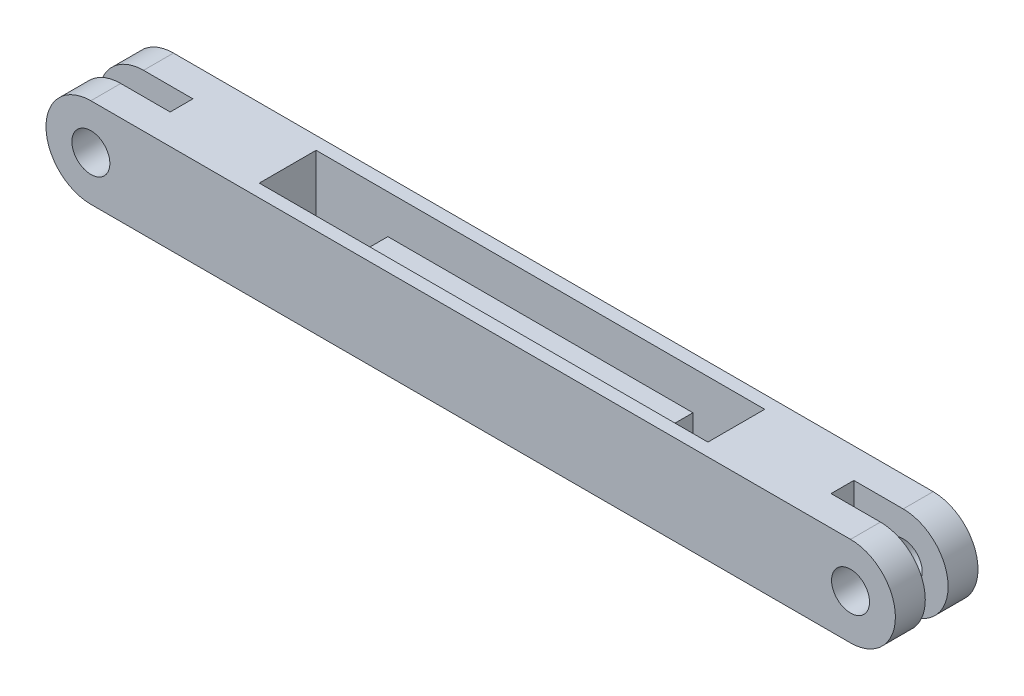
ISO-10303-21;
HEADER;
FILE_DESCRIPTION(('STEP AP214'),'2;1');
FILE_NAME('part.step','',(''),(''),'','','');
FILE_SCHEMA(('AUTOMOTIVE_DESIGN { 1 0 10303 214 1 1 1 1 }'));
ENDSEC;
DATA;
#1=APPLICATION_CONTEXT('core data for automotive mechanical design processes');
#2=APPLICATION_PROTOCOL_DEFINITION('international standard','automotive_design',2000,#1);
#3=PRODUCT_CONTEXT('',#1,'mechanical');
#4=PRODUCT('Part','Part','',(#3));
#5=PRODUCT_RELATED_PRODUCT_CATEGORY('part','',(#4));
#6=PRODUCT_DEFINITION_FORMATION('','',#4);
#7=PRODUCT_DEFINITION_CONTEXT('part definition',#1,'design');
#8=PRODUCT_DEFINITION('design','',#6,#7);
#9=PRODUCT_DEFINITION_SHAPE('','',#8);
#10=(LENGTH_UNIT() NAMED_UNIT(*) SI_UNIT(.MILLI.,.METRE.));
#11=(NAMED_UNIT(*) PLANE_ANGLE_UNIT() SI_UNIT($,.RADIAN.));
#12=(NAMED_UNIT(*) SI_UNIT($,.STERADIAN.) SOLID_ANGLE_UNIT());
#13=UNCERTAINTY_MEASURE_WITH_UNIT(LENGTH_MEASURE(1.E-05),#10,'distance_accuracy_value','');
#14=(GEOMETRIC_REPRESENTATION_CONTEXT(3) GLOBAL_UNCERTAINTY_ASSIGNED_CONTEXT((#13)) GLOBAL_UNIT_ASSIGNED_CONTEXT((#10,
#11,#12)) REPRESENTATION_CONTEXT('',''));
#15=CARTESIAN_POINT('',(0.,0.,0.));
#16=DIRECTION('',(0.,0.,1.));
#17=DIRECTION('',(1.,0.,0.));
#18=AXIS2_PLACEMENT_3D('',#15,#16,#17);
#19=CARTESIAN_POINT('',(0.,1.42391304347826,0.));
#20=DIRECTION('',(0.,-1.,0.));
#21=DIRECTION('',(0.,0.,-1.));
#22=AXIS2_PLACEMENT_3D('',#19,#20,#21);
#23=PLANE('',#22);
#24=DIRECTION('',(0.,0.,-1.));
#25=VECTOR('',#24,1.);
#26=CARTESIAN_POINT('',(-9.2173913043478,1.42391304347826,2.15500000000001));
#27=LINE('',#26,#25);
#28=CARTESIAN_POINT('',(-9.2173913043478,1.42391304347826,11.655));
#29=VERTEX_POINT('',#28);
#30=CARTESIAN_POINT('',(-9.2173913043478,1.42391304347826,2.15500000000001));
#31=VERTEX_POINT('',#30);
#32=EDGE_CURVE('E191',#29,#31,#27,.T.);
#33=ORIENTED_EDGE('',*,*,#32,.F.);
#34=DIRECTION('',(1.,0.,0.));
#35=VECTOR('',#34,1.);
#36=CARTESIAN_POINT('',(-21.2173913043478,1.42391304347826,11.655));
#37=LINE('',#36,#35);
#38=CARTESIAN_POINT('',(41.7826086956522,1.42391304347826,11.655));
#39=VERTEX_POINT('',#38);
#40=EDGE_CURVE('E201',#29,#39,#37,.T.);
#41=ORIENTED_EDGE('',*,*,#40,.T.);
#42=DIRECTION('',(0.,0.,1.));
#43=VECTOR('',#42,1.);
#44=CARTESIAN_POINT('',(41.7826086956522,1.42391304347826,2.15500000000001));
#45=LINE('',#44,#43);
#46=CARTESIAN_POINT('',(41.7826086956522,1.42391304347826,2.15500000000001));
#47=VERTEX_POINT('',#46);
#48=EDGE_CURVE('E200',#47,#39,#45,.T.);
#49=ORIENTED_EDGE('',*,*,#48,.F.);
#50=DIRECTION('',(1.,0.,0.));
#51=VECTOR('',#50,1.);
#52=CARTESIAN_POINT('',(-21.2173913043478,1.42391304347826,2.15500000000001));
#53=LINE('',#52,#51);
#54=EDGE_CURVE('E189',#31,#47,#53,.T.);
#55=ORIENTED_EDGE('',*,*,#54,.F.);
#56=EDGE_LOOP('',(#33,#41,#49,#55));
#57=FACE_BOUND('',#56,.T.);
#58=ADVANCED_FACE('F44',(#57),#23,.F.);
#59=CARTESIAN_POINT('',(-47.2173913043478,7.92391304347826,5.));
#60=DIRECTION('',(0.,-1.,0.));
#61=DIRECTION('',(0.,0.,-1.));
#62=AXIS2_PLACEMENT_3D('',#59,#60,#61);
#63=PLANE('',#62);
#64=DIRECTION('',(-1.,0.,0.));
#65=VECTOR('',#64,1.);
#66=CARTESIAN_POINT('',(-47.2173913043478,7.92391304347826,0.));
#67=LINE('',#66,#65);
#68=CARTESIAN_POINT('',(79.7826086956522,7.92391304347826,0.));
#69=VERTEX_POINT('',#68);
#70=CARTESIAN_POINT('',(-47.2173913043478,7.92391304347826,0.));
#71=VERTEX_POINT('',#70);
#72=EDGE_CURVE('E352',#69,#71,#67,.T.);
#73=ORIENTED_EDGE('',*,*,#72,.T.);
#74=DIRECTION('',(0.,0.,-1.));
#75=VECTOR('',#74,1.);
#76=CARTESIAN_POINT('',(-47.2173913043478,7.92391304347826,5.));
#77=LINE('',#76,#75);
#78=CARTESIAN_POINT('',(-47.2173913043478,7.92391304347826,5.));
#79=VERTEX_POINT('',#78);
#80=EDGE_CURVE('E366',#79,#71,#77,.T.);
#81=ORIENTED_EDGE('',*,*,#80,.F.);
#82=DIRECTION('',(-1.,0.,0.));
#83=VECTOR('',#82,1.);
#84=CARTESIAN_POINT('',(-47.2173913043478,7.92391304347826,5.));
#85=LINE('',#84,#83);
#86=CARTESIAN_POINT('',(-38.9623913043478,7.92391304347826,5.));
#87=VERTEX_POINT('',#86);
#88=EDGE_CURVE('E365',#87,#79,#85,.T.);
#89=ORIENTED_EDGE('',*,*,#88,.F.);
#90=DIRECTION('',(0.,0.,-1.));
#91=VECTOR('',#90,1.);
#92=CARTESIAN_POINT('',(-38.9623913043478,7.92391304347824,8.81));
#93=LINE('',#92,#91);
#94=CARTESIAN_POINT('',(-38.9623913043478,7.92391304347824,8.81));
#95=VERTEX_POINT('',#94);
#96=EDGE_CURVE('E328',#95,#87,#93,.T.);
#97=ORIENTED_EDGE('',*,*,#96,.F.);
#98=DIRECTION('',(-1.,0.,0.));
#99=VECTOR('',#98,1.);
#100=CARTESIAN_POINT('',(-47.2173913043478,7.92391304347826,8.81));
#101=LINE('',#100,#99);
#102=CARTESIAN_POINT('',(-47.2173913043478,7.92391304347826,8.81));
#103=VERTEX_POINT('',#102);
#104=EDGE_CURVE('E282',#95,#103,#101,.T.);
#105=ORIENTED_EDGE('',*,*,#104,.T.);
#106=DIRECTION('',(0.,0.,-1.));
#107=VECTOR('',#106,1.);
#108=CARTESIAN_POINT('',(-47.2173913043478,7.92391304347826,13.81));
#109=LINE('',#108,#107);
#110=CARTESIAN_POINT('',(-47.2173913043478,7.92391304347826,13.81));
#111=VERTEX_POINT('',#110);
#112=EDGE_CURVE('E267',#111,#103,#109,.T.);
#113=ORIENTED_EDGE('',*,*,#112,.F.);
#114=DIRECTION('',(-1.,0.,0.));
#115=VECTOR('',#114,1.);
#116=CARTESIAN_POINT('',(-47.2173913043478,7.92391304347826,13.81));
#117=LINE('',#116,#115);
#118=CARTESIAN_POINT('',(79.7826086956522,7.92391304347826,13.81));
#119=VERTEX_POINT('',#118);
#120=EDGE_CURVE('E270',#119,#111,#117,.T.);
#121=ORIENTED_EDGE('',*,*,#120,.F.);
#122=DIRECTION('',(0.,0.,-1.));
#123=VECTOR('',#122,1.);
#124=CARTESIAN_POINT('',(79.7826086956522,7.92391304347826,13.81));
#125=LINE('',#124,#123);
#126=CARTESIAN_POINT('',(79.7826086956522,7.92391304347826,8.81));
#127=VERTEX_POINT('',#126);
#128=EDGE_CURVE('E289',#119,#127,#125,.T.);
#129=ORIENTED_EDGE('',*,*,#128,.T.);
#130=CARTESIAN_POINT('',(71.5276086956522,7.92391304347826,8.81));
#131=VERTEX_POINT('',#130);
#132=EDGE_CURVE('E261',#127,#131,#101,.T.);
#133=ORIENTED_EDGE('',*,*,#132,.T.);
#134=DIRECTION('',(0.,0.,-1.));
#135=VECTOR('',#134,1.);
#136=CARTESIAN_POINT('',(71.5276086956522,7.92391304347826,8.81));
#137=LINE('',#136,#135);
#138=CARTESIAN_POINT('',(71.5276086956522,7.92391304347826,5.));
#139=VERTEX_POINT('',#138);
#140=EDGE_CURVE('E311',#131,#139,#137,.T.);
#141=ORIENTED_EDGE('',*,*,#140,.T.);
#142=CARTESIAN_POINT('',(79.7826086956522,7.92391304347826,5.));
#143=VERTEX_POINT('',#142);
#144=EDGE_CURVE('E361',#143,#139,#85,.T.);
#145=ORIENTED_EDGE('',*,*,#144,.F.);
#146=DIRECTION('',(0.,0.,-1.));
#147=VECTOR('',#146,1.);
#148=CARTESIAN_POINT('',(79.7826086956522,7.92391304347826,5.));
#149=LINE('',#148,#147);
#150=EDGE_CURVE('E382',#143,#69,#149,.T.);
#151=ORIENTED_EDGE('',*,*,#150,.T.);
#152=EDGE_LOOP('',(#73,#81,#89,#97,#105,#113,#121,#129,#133,#141,#145,#151));
#153=FACE_BOUND('',#152,.T.);
#154=DIRECTION('',(0.,0.,-1.));
#155=VECTOR('',#154,1.);
#156=CARTESIAN_POINT('',(-21.2173913043478,7.92391304347826,11.655));
#157=LINE('',#156,#155);
#158=CARTESIAN_POINT('',(-21.2173913043478,7.92391304347826,11.655));
#159=VERTEX_POINT('',#158);
#160=CARTESIAN_POINT('',(-21.2173913043478,7.92391304347826,2.15500000000001));
#161=VERTEX_POINT('',#160);
#162=EDGE_CURVE('E195',#159,#161,#157,.T.);
#163=ORIENTED_EDGE('',*,*,#162,.T.);
#164=DIRECTION('',(1.,0.,0.));
#165=VECTOR('',#164,1.);
#166=CARTESIAN_POINT('',(-21.2173913043478,7.92391304347826,2.15500000000001));
#167=LINE('',#166,#165);
#168=CARTESIAN_POINT('',(53.7826086956522,7.92391304347826,2.15500000000001));
#169=VERTEX_POINT('',#168);
#170=EDGE_CURVE('E218',#161,#169,#167,.T.);
#171=ORIENTED_EDGE('',*,*,#170,.T.);
#172=DIRECTION('',(0.,0.,-1.));
#173=VECTOR('',#172,1.);
#174=CARTESIAN_POINT('',(53.7826086956522,7.92391304347826,11.655));
#175=LINE('',#174,#173);
#176=CARTESIAN_POINT('',(53.7826086956522,7.92391304347826,11.655));
#177=VERTEX_POINT('',#176);
#178=EDGE_CURVE('E212',#177,#169,#175,.T.);
#179=ORIENTED_EDGE('',*,*,#178,.F.);
#180=DIRECTION('',(1.,0.,0.));
#181=VECTOR('',#180,1.);
#182=CARTESIAN_POINT('',(-21.2173913043478,7.92391304347826,11.655));
#183=LINE('',#182,#181);
#184=EDGE_CURVE('E204',#159,#177,#183,.T.);
#185=ORIENTED_EDGE('',*,*,#184,.F.);
#186=EDGE_LOOP('',(#163,#171,#179,#185));
#187=FACE_BOUND('',#186,.T.);
#188=ADVANCED_FACE('F443',(#153,#187),#63,.F.);
#189=CARTESIAN_POINT('',(-47.2173913043478,0.423913043478259,5.));
#190=DIRECTION('',(0.,0.,1.));
#191=DIRECTION('',(1.,0.,0.));
#192=AXIS2_PLACEMENT_3D('',#189,#190,#191);
#193=PLANE('',#192);
#194=DIRECTION('',(0.,1.,0.));
#195=VECTOR('',#194,1.);
#196=CARTESIAN_POINT('',(71.5276086956522,-7.07608695652172,5.));
#197=LINE('',#196,#195);
#198=CARTESIAN_POINT('',(71.5276086956522,-7.07608695652174,5.));
#199=VERTEX_POINT('',#198);
#200=EDGE_CURVE('E310',#199,#139,#197,.T.);
#201=ORIENTED_EDGE('',*,*,#200,.F.);
#202=DIRECTION('',(1.,0.,0.));
#203=VECTOR('',#202,1.);
#204=CARTESIAN_POINT('',(-47.2173913043478,-7.07608695652174,5.));
#205=LINE('',#204,#203);
#206=CARTESIAN_POINT('',(79.7826086956522,-7.07608695652174,5.));
#207=VERTEX_POINT('',#206);
#208=EDGE_CURVE('E354',#199,#207,#205,.T.);
#209=ORIENTED_EDGE('',*,*,#208,.T.);
#210=CARTESIAN_POINT('',(79.7826086956522,0.423913043478259,5.));
#211=DIRECTION('',(0.,0.,1.));
#212=DIRECTION('',(1.,0.,0.));
#213=AXIS2_PLACEMENT_3D('',#210,#211,#212);
#214=CIRCLE('',#213,7.5);
#215=EDGE_CURVE('E360',#207,#143,#214,.T.);
#216=ORIENTED_EDGE('',*,*,#215,.T.);
#217=ORIENTED_EDGE('',*,*,#144,.T.);
#218=EDGE_LOOP('',(#201,#209,#216,#217));
#219=FACE_BOUND('',#218,.T.);
#220=CARTESIAN_POINT('',(79.7826086956522,0.423913043478259,5.));
#221=DIRECTION('',(0.,0.,1.));
#222=DIRECTION('',(1.,0.,0.));
#223=AXIS2_PLACEMENT_3D('',#220,#221,#222);
#224=CIRCLE('',#223,3.175);
#225=CARTESIAN_POINT('',(82.9576086956522,0.423913043478259,5.));
#226=VERTEX_POINT('',#225);
#227=EDGE_CURVE('E334',#226,#226,#224,.T.);
#228=ORIENTED_EDGE('',*,*,#227,.F.);
#229=EDGE_LOOP('',(#228));
#230=FACE_BOUND('',#229,.T.);
#231=ADVANCED_FACE('F446',(#219,#230),#193,.T.);
#232=DIRECTION('',(0.,-1.,0.));
#233=VECTOR('',#232,1.);
#234=CARTESIAN_POINT('',(-38.9623913043478,-7.07608695652172,5.));
#235=LINE('',#234,#233);
#236=CARTESIAN_POINT('',(-38.9623913043478,-7.07608695652172,5.));
#237=VERTEX_POINT('',#236);
#238=EDGE_CURVE('E301',#87,#237,#235,.T.);
#239=ORIENTED_EDGE('',*,*,#238,.F.);
#240=ORIENTED_EDGE('',*,*,#88,.T.);
#241=CARTESIAN_POINT('',(-47.2173913043478,0.423913043478259,5.));
#242=DIRECTION('',(0.,0.,1.));
#243=DIRECTION('',(1.,0.,0.));
#244=AXIS2_PLACEMENT_3D('',#241,#242,#243);
#245=CIRCLE('',#244,7.5);
#246=CARTESIAN_POINT('',(-47.2173913043478,-7.07608695652174,5.));
#247=VERTEX_POINT('',#246);
#248=EDGE_CURVE('E350',#79,#247,#245,.T.);
#249=ORIENTED_EDGE('',*,*,#248,.T.);
#250=EDGE_CURVE('E358',#247,#237,#205,.T.);
#251=ORIENTED_EDGE('',*,*,#250,.T.);
#252=EDGE_LOOP('',(#239,#240,#249,#251));
#253=FACE_BOUND('',#252,.T.);
#254=CARTESIAN_POINT('',(-47.2173913043478,0.423913043478259,5.));
#255=DIRECTION('',(0.,0.,1.));
#256=DIRECTION('',(1.,0.,0.));
#257=AXIS2_PLACEMENT_3D('',#254,#255,#256);
#258=CIRCLE('',#257,3.175);
#259=CARTESIAN_POINT('',(-44.0423913043478,0.423913043478259,5.));
#260=VERTEX_POINT('',#259);
#261=EDGE_CURVE('E345',#260,#260,#258,.T.);
#262=ORIENTED_EDGE('',*,*,#261,.F.);
#263=EDGE_LOOP('',(#262));
#264=FACE_BOUND('',#263,.T.);
#265=ADVANCED_FACE('F502',(#253,#264),#193,.T.);
#266=CARTESIAN_POINT('',(-47.2173913043478,0.423913043478259,0.));
#267=DIRECTION('',(0.,0.,1.));
#268=DIRECTION('',(1.,0.,0.));
#269=AXIS2_PLACEMENT_3D('',#266,#267,#268);
#270=PLANE('',#269);
#271=CARTESIAN_POINT('',(-47.2173913043478,0.423913043478259,0.));
#272=DIRECTION('',(0.,0.,1.));
#273=DIRECTION('',(1.,0.,0.));
#274=AXIS2_PLACEMENT_3D('',#271,#272,#273);
#275=CIRCLE('',#274,7.5);
#276=CARTESIAN_POINT('',(-47.2173913043478,-7.07608695652174,0.));
#277=VERTEX_POINT('',#276);
#278=EDGE_CURVE('E346',#71,#277,#275,.T.);
#279=ORIENTED_EDGE('',*,*,#278,.F.);
#280=ORIENTED_EDGE('',*,*,#72,.F.);
#281=CARTESIAN_POINT('',(79.7826086956522,0.423913043478259,0.));
#282=DIRECTION('',(0.,0.,1.));
#283=DIRECTION('',(1.,0.,0.));
#284=AXIS2_PLACEMENT_3D('',#281,#282,#283);
#285=CIRCLE('',#284,7.5);
#286=CARTESIAN_POINT('',(79.7826086956522,-7.07608695652174,0.));
#287=VERTEX_POINT('',#286);
#288=EDGE_CURVE('E373',#287,#69,#285,.T.);
#289=ORIENTED_EDGE('',*,*,#288,.F.);
#290=DIRECTION('',(1.,0.,0.));
#291=VECTOR('',#290,1.);
#292=CARTESIAN_POINT('',(-47.2173913043478,-7.07608695652174,0.));
#293=LINE('',#292,#291);
#294=EDGE_CURVE('E369',#277,#287,#293,.T.);
#295=ORIENTED_EDGE('',*,*,#294,.F.);
#296=EDGE_LOOP('',(#279,#280,#289,#295));
#297=FACE_BOUND('',#296,.T.);
#298=CARTESIAN_POINT('',(-47.2173913043478,0.423913043478259,0.));
#299=DIRECTION('',(0.,0.,1.));
#300=DIRECTION('',(1.,0.,0.));
#301=AXIS2_PLACEMENT_3D('',#298,#299,#300);
#302=CIRCLE('',#301,3.175);
#303=CARTESIAN_POINT('',(-44.0423913043478,0.423913043478259,0.));
#304=VERTEX_POINT('',#303);
#305=EDGE_CURVE('E336',#304,#304,#302,.T.);
#306=ORIENTED_EDGE('',*,*,#305,.T.);
#307=EDGE_LOOP('',(#306));
#308=FACE_BOUND('',#307,.T.);
#309=CARTESIAN_POINT('',(79.7826086956522,0.423913043478259,0.));
#310=DIRECTION('',(0.,0.,1.));
#311=DIRECTION('',(1.,0.,0.));
#312=AXIS2_PLACEMENT_3D('',#309,#310,#311);
#313=CIRCLE('',#312,3.175);
#314=CARTESIAN_POINT('',(82.9576086956522,0.423913043478259,0.));
#315=VERTEX_POINT('',#314);
#316=EDGE_CURVE('E331',#315,#315,#313,.T.);
#317=ORIENTED_EDGE('',*,*,#316,.T.);
#318=EDGE_LOOP('',(#317));
#319=FACE_BOUND('',#318,.T.);
#320=ADVANCED_FACE('F510',(#297,#308,#319),#270,.F.);
#321=CARTESIAN_POINT('',(-47.2173913043478,0.423913043478259,5.));
#322=DIRECTION('',(0.,0.,-1.));
#323=DIRECTION('',(-1.,0.,0.));
#324=AXIS2_PLACEMENT_3D('',#321,#322,#323);
#325=CYLINDRICAL_SURFACE('',#324,7.5);
#326=ORIENTED_EDGE('',*,*,#278,.T.);
#327=DIRECTION('',(0.,0.,-1.));
#328=VECTOR('',#327,1.);
#329=CARTESIAN_POINT('',(-47.2173913043478,-7.07608695652174,5.));
#330=LINE('',#329,#328);
#331=EDGE_CURVE('E386',#247,#277,#330,.T.);
#332=ORIENTED_EDGE('',*,*,#331,.F.);
#333=ORIENTED_EDGE('',*,*,#248,.F.);
#334=ORIENTED_EDGE('',*,*,#80,.T.);
#335=EDGE_LOOP('',(#326,#332,#333,#334));
#336=FACE_BOUND('',#335,.T.);
#337=ADVANCED_FACE('F50',(#336),#325,.T.);
#338=CARTESIAN_POINT('',(-47.2173913043478,-7.07608695652174,5.));
#339=DIRECTION('',(0.,1.,0.));
#340=DIRECTION('',(-1.,0.,0.));
#341=AXIS2_PLACEMENT_3D('',#338,#339,#340);
#342=PLANE('',#341);
#343=DIRECTION('',(-1.,0.,0.));
#344=VECTOR('',#343,1.);
#345=CARTESIAN_POINT('',(-47.2173913043478,-7.07608695652174,2.15500000000001));
#346=LINE('',#345,#344);
#347=CARTESIAN_POINT('',(-9.2173913043478,-7.07608695652174,2.15500000000001));
#348=VERTEX_POINT('',#347);
#349=CARTESIAN_POINT('',(-21.2173913043478,-7.07608695652174,2.15500000000001));
#350=VERTEX_POINT('',#349);
#351=EDGE_CURVE('E53',#348,#350,#346,.T.);
#352=ORIENTED_EDGE('',*,*,#351,.T.);
#353=DIRECTION('',(0.,0.,1.));
#354=VECTOR('',#353,1.);
#355=CARTESIAN_POINT('',(-21.2173913043478,-7.07608695652174,5.));
#356=LINE('',#355,#354);
#357=CARTESIAN_POINT('',(-21.2173913043478,-7.07608695652174,11.655));
#358=VERTEX_POINT('',#357);
#359=EDGE_CURVE('E11',#350,#358,#356,.T.);
#360=ORIENTED_EDGE('',*,*,#359,.T.);
#361=DIRECTION('',(1.,0.,0.));
#362=VECTOR('',#361,1.);
#363=CARTESIAN_POINT('',(-47.2173913043478,-7.07608695652174,11.655));
#364=LINE('',#363,#362);
#365=CARTESIAN_POINT('',(-9.2173913043478,-7.07608695652174,11.655));
#366=VERTEX_POINT('',#365);
#367=EDGE_CURVE('E406',#358,#366,#364,.T.);
#368=ORIENTED_EDGE('',*,*,#367,.T.);
#369=DIRECTION('',(0.,0.,-1.));
#370=VECTOR('',#369,1.);
#371=CARTESIAN_POINT('',(-9.2173913043478,-7.07608695652174,4.99999999999999));
#372=LINE('',#371,#370);
#373=EDGE_CURVE('E414',#366,#348,#372,.T.);
#374=ORIENTED_EDGE('',*,*,#373,.T.);
#375=EDGE_LOOP('',(#352,#360,#368,#374));
#376=FACE_BOUND('',#375,.T.);
#377=DIRECTION('',(1.,0.,0.));
#378=VECTOR('',#377,1.);
#379=CARTESIAN_POINT('',(-47.2173913043478,-7.07608695652174,11.655));
#380=LINE('',#379,#378);
#381=CARTESIAN_POINT('',(41.7826086956522,-7.07608695652174,11.655));
#382=VERTEX_POINT('',#381);
#383=CARTESIAN_POINT('',(53.7826086956522,-7.07608695652174,11.655));
#384=VERTEX_POINT('',#383);
#385=EDGE_CURVE('E402',#382,#384,#380,.T.);
#386=ORIENTED_EDGE('',*,*,#385,.T.);
#387=DIRECTION('',(0.,0.,-1.));
#388=VECTOR('',#387,1.);
#389=CARTESIAN_POINT('',(53.7826086956522,-7.07608695652174,5.));
#390=LINE('',#389,#388);
#391=CARTESIAN_POINT('',(53.7826086956522,-7.07608695652174,2.15500000000001));
#392=VERTEX_POINT('',#391);
#393=EDGE_CURVE('E403',#384,#392,#390,.T.);
#394=ORIENTED_EDGE('',*,*,#393,.T.);
#395=DIRECTION('',(-1.,0.,0.));
#396=VECTOR('',#395,1.);
#397=CARTESIAN_POINT('',(-47.2173913043478,-7.07608695652174,2.15500000000002));
#398=LINE('',#397,#396);
#399=CARTESIAN_POINT('',(41.7826086956522,-7.07608695652174,2.15500000000001));
#400=VERTEX_POINT('',#399);
#401=EDGE_CURVE('E394',#392,#400,#398,.T.);
#402=ORIENTED_EDGE('',*,*,#401,.T.);
#403=DIRECTION('',(0.,0.,1.));
#404=VECTOR('',#403,1.);
#405=CARTESIAN_POINT('',(41.7826086956522,-7.07608695652174,5.));
#406=LINE('',#405,#404);
#407=EDGE_CURVE('E400',#400,#382,#406,.T.);
#408=ORIENTED_EDGE('',*,*,#407,.T.);
#409=EDGE_LOOP('',(#386,#394,#402,#408));
#410=FACE_BOUND('',#409,.T.);
#411=ORIENTED_EDGE('',*,*,#294,.T.);
#412=DIRECTION('',(0.,0.,-1.));
#413=VECTOR('',#412,1.);
#414=CARTESIAN_POINT('',(79.7826086956522,-7.07608695652174,5.));
#415=LINE('',#414,#413);
#416=EDGE_CURVE('E383',#207,#287,#415,.T.);
#417=ORIENTED_EDGE('',*,*,#416,.F.);
#418=ORIENTED_EDGE('',*,*,#208,.F.);
#419=DIRECTION('',(0.,0.,-1.));
#420=VECTOR('',#419,1.);
#421=CARTESIAN_POINT('',(71.5276086956522,-7.07608695652172,8.81));
#422=LINE('',#421,#420);
#423=CARTESIAN_POINT('',(71.5276086956522,-7.07608695652172,8.81));
#424=VERTEX_POINT('',#423);
#425=EDGE_CURVE('E322',#424,#199,#422,.T.);
#426=ORIENTED_EDGE('',*,*,#425,.F.);
#427=DIRECTION('',(1.,0.,0.));
#428=VECTOR('',#427,1.);
#429=CARTESIAN_POINT('',(-47.2173913043478,-7.07608695652174,8.81));
#430=LINE('',#429,#428);
#431=CARTESIAN_POINT('',(79.7826086956522,-7.07608695652174,8.81));
#432=VERTEX_POINT('',#431);
#433=EDGE_CURVE('E274',#424,#432,#430,.T.);
#434=ORIENTED_EDGE('',*,*,#433,.T.);
#435=DIRECTION('',(0.,0.,-1.));
#436=VECTOR('',#435,1.);
#437=CARTESIAN_POINT('',(79.7826086956522,-7.07608695652174,13.81));
#438=LINE('',#437,#436);
#439=CARTESIAN_POINT('',(79.7826086956522,-7.07608695652174,13.81));
#440=VERTEX_POINT('',#439);
#441=EDGE_CURVE('E291',#440,#432,#438,.T.);
#442=ORIENTED_EDGE('',*,*,#441,.F.);
#443=DIRECTION('',(1.,0.,0.));
#444=VECTOR('',#443,1.);
#445=CARTESIAN_POINT('',(-47.2173913043478,-7.07608695652174,13.81));
#446=LINE('',#445,#444);
#447=CARTESIAN_POINT('',(-47.2173913043478,-7.07608695652174,13.81));
#448=VERTEX_POINT('',#447);
#449=EDGE_CURVE('E258',#448,#440,#446,.T.);
#450=ORIENTED_EDGE('',*,*,#449,.F.);
#451=DIRECTION('',(0.,0.,-1.));
#452=VECTOR('',#451,1.);
#453=CARTESIAN_POINT('',(-47.2173913043478,-7.07608695652174,13.81));
#454=LINE('',#453,#452);
#455=CARTESIAN_POINT('',(-47.2173913043478,-7.07608695652174,8.81));
#456=VERTEX_POINT('',#455);
#457=EDGE_CURVE('E300',#448,#456,#454,.T.);
#458=ORIENTED_EDGE('',*,*,#457,.T.);
#459=CARTESIAN_POINT('',(-38.9623913043478,-7.07608695652172,8.81));
#460=VERTEX_POINT('',#459);
#461=EDGE_CURVE('E273',#456,#460,#430,.T.);
#462=ORIENTED_EDGE('',*,*,#461,.T.);
#463=DIRECTION('',(0.,0.,-1.));
#464=VECTOR('',#463,1.);
#465=CARTESIAN_POINT('',(-38.9623913043478,-7.07608695652172,8.81));
#466=LINE('',#465,#464);
#467=EDGE_CURVE('E323',#460,#237,#466,.T.);
#468=ORIENTED_EDGE('',*,*,#467,.T.);
#469=ORIENTED_EDGE('',*,*,#250,.F.);
#470=ORIENTED_EDGE('',*,*,#331,.T.);
#471=EDGE_LOOP('',(#411,#417,#418,#426,#434,#442,#450,#458,#462,#468,#469,#470));
#472=FACE_BOUND('',#471,.T.);
#473=ADVANCED_FACE('F420',(#376,#410,#472),#342,.F.);
#474=CARTESIAN_POINT('',(79.7826086956522,0.423913043478259,5.));
#475=DIRECTION('',(0.,0.,-1.));
#476=DIRECTION('',(-1.,0.,0.));
#477=AXIS2_PLACEMENT_3D('',#474,#475,#476);
#478=CYLINDRICAL_SURFACE('',#477,7.5);
#479=ORIENTED_EDGE('',*,*,#288,.T.);
#480=ORIENTED_EDGE('',*,*,#150,.F.);
#481=ORIENTED_EDGE('',*,*,#215,.F.);
#482=ORIENTED_EDGE('',*,*,#416,.T.);
#483=EDGE_LOOP('',(#479,#480,#481,#482));
#484=FACE_BOUND('',#483,.T.);
#485=ADVANCED_FACE('F505',(#484),#478,.T.);
#486=CARTESIAN_POINT('',(-47.2173913043478,0.423913043478259,5.));
#487=DIRECTION('',(0.,0.,-1.));
#488=DIRECTION('',(-1.,0.,0.));
#489=AXIS2_PLACEMENT_3D('',#486,#487,#488);
#490=CYLINDRICAL_SURFACE('',#489,3.175);
#491=ORIENTED_EDGE('',*,*,#261,.T.);
#492=EDGE_LOOP('',(#491));
#493=FACE_BOUND('',#492,.T.);
#494=ORIENTED_EDGE('',*,*,#305,.F.);
#495=EDGE_LOOP('',(#494));
#496=FACE_BOUND('',#495,.T.);
#497=ADVANCED_FACE('F498',(#493,#496),#490,.F.);
#498=CARTESIAN_POINT('',(79.7826086956522,0.423913043478259,5.));
#499=DIRECTION('',(0.,0.,-1.));
#500=DIRECTION('',(-1.,0.,0.));
#501=AXIS2_PLACEMENT_3D('',#498,#499,#500);
#502=CYLINDRICAL_SURFACE('',#501,3.175);
#503=ORIENTED_EDGE('',*,*,#227,.T.);
#504=EDGE_LOOP('',(#503));
#505=FACE_BOUND('',#504,.T.);
#506=ORIENTED_EDGE('',*,*,#316,.F.);
#507=EDGE_LOOP('',(#506));
#508=FACE_BOUND('',#507,.T.);
#509=ADVANCED_FACE('F494',(#505,#508),#502,.F.);
#510=CARTESIAN_POINT('',(-38.9623913043478,-7.07608695652172,8.81));
#511=DIRECTION('',(1.,0.,0.));
#512=DIRECTION('',(0.,0.,-1.));
#513=AXIS2_PLACEMENT_3D('',#510,#511,#512);
#514=PLANE('',#513);
#515=ORIENTED_EDGE('',*,*,#238,.T.);
#516=ORIENTED_EDGE('',*,*,#467,.F.);
#517=DIRECTION('',(0.,-1.,0.));
#518=VECTOR('',#517,1.);
#519=CARTESIAN_POINT('',(-38.9623913043478,-7.07608695652172,8.81));
#520=LINE('',#519,#518);
#521=EDGE_CURVE('E305',#95,#460,#520,.T.);
#522=ORIENTED_EDGE('',*,*,#521,.F.);
#523=ORIENTED_EDGE('',*,*,#96,.T.);
#524=EDGE_LOOP('',(#515,#516,#522,#523));
#525=FACE_BOUND('',#524,.T.);
#526=ADVANCED_FACE('F489',(#525),#514,.F.);
#527=CARTESIAN_POINT('',(71.5276086956522,-7.07608695652172,8.81));
#528=DIRECTION('',(-1.,0.,0.));
#529=DIRECTION('',(0.,0.,1.));
#530=AXIS2_PLACEMENT_3D('',#527,#528,#529);
#531=PLANE('',#530);
#532=ORIENTED_EDGE('',*,*,#200,.T.);
#533=ORIENTED_EDGE('',*,*,#140,.F.);
#534=DIRECTION('',(0.,1.,0.));
#535=VECTOR('',#534,1.);
#536=CARTESIAN_POINT('',(71.5276086956522,-7.07608695652172,8.81));
#537=LINE('',#536,#535);
#538=EDGE_CURVE('E306',#424,#131,#537,.T.);
#539=ORIENTED_EDGE('',*,*,#538,.F.);
#540=ORIENTED_EDGE('',*,*,#425,.T.);
#541=EDGE_LOOP('',(#532,#533,#539,#540));
#542=FACE_BOUND('',#541,.T.);
#543=ADVANCED_FACE('F480',(#542),#531,.F.);
#544=CARTESIAN_POINT('',(-47.2173913043478,0.423913043478259,8.81));
#545=DIRECTION('',(0.,0.,1.));
#546=DIRECTION('',(1.,0.,0.));
#547=AXIS2_PLACEMENT_3D('',#544,#545,#546);
#548=PLANE('',#547);
#549=CARTESIAN_POINT('',(-47.2173913043478,0.423913043478259,8.81));
#550=DIRECTION('',(0.,0.,1.));
#551=DIRECTION('',(1.,0.,0.));
#552=AXIS2_PLACEMENT_3D('',#549,#550,#551);
#553=CIRCLE('',#552,3.175);
#554=CARTESIAN_POINT('',(-44.0423913043478,0.423913043478259,8.81));
#555=VERTEX_POINT('',#554);
#556=EDGE_CURVE('E242',#555,#555,#553,.T.);
#557=ORIENTED_EDGE('',*,*,#556,.T.);
#558=EDGE_LOOP('',(#557));
#559=FACE_BOUND('',#558,.T.);
#560=ORIENTED_EDGE('',*,*,#104,.F.);
#561=ORIENTED_EDGE('',*,*,#521,.T.);
#562=ORIENTED_EDGE('',*,*,#461,.F.);
#563=CARTESIAN_POINT('',(-47.2173913043478,0.423913043478259,8.81));
#564=DIRECTION('',(0.,0.,1.));
#565=DIRECTION('',(1.,0.,0.));
#566=AXIS2_PLACEMENT_3D('',#563,#564,#565);
#567=CIRCLE('',#566,7.5);
#568=EDGE_CURVE('E255',#103,#456,#567,.T.);
#569=ORIENTED_EDGE('',*,*,#568,.F.);
#570=EDGE_LOOP('',(#560,#561,#562,#569));
#571=FACE_BOUND('',#570,.T.);
#572=ADVANCED_FACE('F477',(#559,#571),#548,.F.);
#573=CARTESIAN_POINT('',(79.7826086956522,0.423913043478259,8.81));
#574=DIRECTION('',(0.,0.,1.));
#575=DIRECTION('',(1.,0.,0.));
#576=AXIS2_PLACEMENT_3D('',#573,#574,#575);
#577=CIRCLE('',#576,3.175);
#578=CARTESIAN_POINT('',(82.9576086956522,0.423913043478259,8.81));
#579=VERTEX_POINT('',#578);
#580=EDGE_CURVE('E237',#579,#579,#577,.T.);
#581=ORIENTED_EDGE('',*,*,#580,.T.);
#582=EDGE_LOOP('',(#581));
#583=FACE_BOUND('',#582,.T.);
#584=ORIENTED_EDGE('',*,*,#433,.F.);
#585=ORIENTED_EDGE('',*,*,#538,.T.);
#586=ORIENTED_EDGE('',*,*,#132,.F.);
#587=CARTESIAN_POINT('',(79.7826086956522,0.423913043478259,8.81));
#588=DIRECTION('',(0.,0.,1.));
#589=DIRECTION('',(1.,0.,0.));
#590=AXIS2_PLACEMENT_3D('',#587,#588,#589);
#591=CIRCLE('',#590,7.5);
#592=EDGE_CURVE('E276',#432,#127,#591,.T.);
#593=ORIENTED_EDGE('',*,*,#592,.F.);
#594=EDGE_LOOP('',(#584,#585,#586,#593));
#595=FACE_BOUND('',#594,.T.);
#596=ADVANCED_FACE('F473',(#583,#595),#548,.F.);
#597=CARTESIAN_POINT('',(-47.2173913043478,0.423913043478259,13.81));
#598=DIRECTION('',(0.,0.,1.));
#599=DIRECTION('',(1.,0.,0.));
#600=AXIS2_PLACEMENT_3D('',#597,#598,#599);
#601=PLANE('',#600);
#602=CARTESIAN_POINT('',(-47.2173913043478,0.423913043478259,13.81));
#603=DIRECTION('',(0.,0.,1.));
#604=DIRECTION('',(1.,0.,0.));
#605=AXIS2_PLACEMENT_3D('',#602,#603,#604);
#606=CIRCLE('',#605,3.175);
#607=CARTESIAN_POINT('',(-44.0423913043478,0.423913043478259,13.81));
#608=VERTEX_POINT('',#607);
#609=EDGE_CURVE('E247',#608,#608,#606,.T.);
#610=ORIENTED_EDGE('',*,*,#609,.F.);
#611=EDGE_LOOP('',(#610));
#612=FACE_BOUND('',#611,.T.);
#613=CARTESIAN_POINT('',(-47.2173913043478,0.423913043478259,13.81));
#614=DIRECTION('',(0.,0.,1.));
#615=DIRECTION('',(1.,0.,0.));
#616=AXIS2_PLACEMENT_3D('',#613,#614,#615);
#617=CIRCLE('',#616,7.5);
#618=EDGE_CURVE('E257',#111,#448,#617,.T.);
#619=ORIENTED_EDGE('',*,*,#618,.T.);
#620=ORIENTED_EDGE('',*,*,#449,.T.);
#621=CARTESIAN_POINT('',(79.7826086956522,0.423913043478259,13.81));
#622=DIRECTION('',(0.,0.,1.));
#623=DIRECTION('',(1.,0.,0.));
#624=AXIS2_PLACEMENT_3D('',#621,#622,#623);
#625=CIRCLE('',#624,7.5);
#626=EDGE_CURVE('E263',#440,#119,#625,.T.);
#627=ORIENTED_EDGE('',*,*,#626,.T.);
#628=ORIENTED_EDGE('',*,*,#120,.T.);
#629=EDGE_LOOP('',(#619,#620,#627,#628));
#630=FACE_BOUND('',#629,.T.);
#631=CARTESIAN_POINT('',(79.7826086956522,0.423913043478259,13.81));
#632=DIRECTION('',(0.,0.,1.));
#633=DIRECTION('',(1.,0.,0.));
#634=AXIS2_PLACEMENT_3D('',#631,#632,#633);
#635=CIRCLE('',#634,3.175);
#636=CARTESIAN_POINT('',(82.9576086956522,0.423913043478259,13.81));
#637=VERTEX_POINT('',#636);
#638=EDGE_CURVE('E239',#637,#637,#635,.T.);
#639=ORIENTED_EDGE('',*,*,#638,.F.);
#640=EDGE_LOOP('',(#639));
#641=FACE_BOUND('',#640,.T.);
#642=ADVANCED_FACE('F472',(#612,#630,#641),#601,.T.);
#643=CARTESIAN_POINT('',(-47.2173913043478,0.423913043478259,13.81));
#644=DIRECTION('',(0.,0.,-1.));
#645=DIRECTION('',(-1.,0.,0.));
#646=AXIS2_PLACEMENT_3D('',#643,#644,#645);
#647=CYLINDRICAL_SURFACE('',#646,7.5);
#648=ORIENTED_EDGE('',*,*,#568,.T.);
#649=ORIENTED_EDGE('',*,*,#457,.F.);
#650=ORIENTED_EDGE('',*,*,#618,.F.);
#651=ORIENTED_EDGE('',*,*,#112,.T.);
#652=EDGE_LOOP('',(#648,#649,#650,#651));
#653=FACE_BOUND('',#652,.T.);
#654=ADVANCED_FACE('F471',(#653),#647,.T.);
#655=CARTESIAN_POINT('',(79.7826086956522,0.423913043478259,13.81));
#656=DIRECTION('',(0.,0.,-1.));
#657=DIRECTION('',(-1.,0.,0.));
#658=AXIS2_PLACEMENT_3D('',#655,#656,#657);
#659=CYLINDRICAL_SURFACE('',#658,7.5);
#660=ORIENTED_EDGE('',*,*,#592,.T.);
#661=ORIENTED_EDGE('',*,*,#128,.F.);
#662=ORIENTED_EDGE('',*,*,#626,.F.);
#663=ORIENTED_EDGE('',*,*,#441,.T.);
#664=EDGE_LOOP('',(#660,#661,#662,#663));
#665=FACE_BOUND('',#664,.T.);
#666=ADVANCED_FACE('F469',(#665),#659,.T.);
#667=CARTESIAN_POINT('',(-47.2173913043478,0.423913043478259,13.81));
#668=DIRECTION('',(0.,0.,-1.));
#669=DIRECTION('',(-1.,0.,0.));
#670=AXIS2_PLACEMENT_3D('',#667,#668,#669);
#671=CYLINDRICAL_SURFACE('',#670,3.175);
#672=ORIENTED_EDGE('',*,*,#609,.T.);
#673=EDGE_LOOP('',(#672));
#674=FACE_BOUND('',#673,.T.);
#675=ORIENTED_EDGE('',*,*,#556,.F.);
#676=EDGE_LOOP('',(#675));
#677=FACE_BOUND('',#676,.T.);
#678=ADVANCED_FACE('F462',(#674,#677),#671,.F.);
#679=CARTESIAN_POINT('',(79.7826086956522,0.423913043478259,13.81));
#680=DIRECTION('',(0.,0.,-1.));
#681=DIRECTION('',(-1.,0.,0.));
#682=AXIS2_PLACEMENT_3D('',#679,#680,#681);
#683=CYLINDRICAL_SURFACE('',#682,3.175);
#684=ORIENTED_EDGE('',*,*,#638,.T.);
#685=EDGE_LOOP('',(#684));
#686=FACE_BOUND('',#685,.T.);
#687=ORIENTED_EDGE('',*,*,#580,.F.);
#688=EDGE_LOOP('',(#687));
#689=FACE_BOUND('',#688,.T.);
#690=ADVANCED_FACE('F463',(#686,#689),#683,.F.);
#691=CARTESIAN_POINT('',(-21.2173913043478,1.42391304347826,11.655));
#692=DIRECTION('',(1.,0.,0.));
#693=DIRECTION('',(0.,0.,-1.));
#694=AXIS2_PLACEMENT_3D('',#691,#692,#693);
#695=PLANE('',#694);
#696=ORIENTED_EDGE('',*,*,#162,.F.);
#697=DIRECTION('',(0.,1.,0.));
#698=VECTOR('',#697,1.);
#699=CARTESIAN_POINT('',(-21.2173913043478,1.42391304347826,11.655));
#700=LINE('',#699,#698);
#701=EDGE_CURVE('E206',#358,#159,#700,.T.);
#702=ORIENTED_EDGE('',*,*,#701,.F.);
#703=ORIENTED_EDGE('',*,*,#359,.F.);
#704=DIRECTION('',(0.,1.,0.));
#705=VECTOR('',#704,1.);
#706=CARTESIAN_POINT('',(-21.2173913043478,1.42391304347826,2.15500000000001));
#707=LINE('',#706,#705);
#708=EDGE_CURVE('E232',#350,#161,#707,.T.);
#709=ORIENTED_EDGE('',*,*,#708,.T.);
#710=EDGE_LOOP('',(#696,#702,#703,#709));
#711=FACE_BOUND('',#710,.T.);
#712=ADVANCED_FACE('F459',(#711),#695,.T.);
#713=CARTESIAN_POINT('',(-21.2173913043478,1.42391304347826,2.15500000000001));
#714=DIRECTION('',(0.,0.,1.));
#715=DIRECTION('',(1.,0.,0.));
#716=AXIS2_PLACEMENT_3D('',#713,#714,#715);
#717=PLANE('',#716);
#718=ORIENTED_EDGE('',*,*,#170,.F.);
#719=ORIENTED_EDGE('',*,*,#708,.F.);
#720=ORIENTED_EDGE('',*,*,#351,.F.);
#721=DIRECTION('',(0.,1.,0.));
#722=VECTOR('',#721,1.);
#723=CARTESIAN_POINT('',(-9.2173913043478,-7.87008695652174,2.15500000000001));
#724=LINE('',#723,#722);
#725=EDGE_CURVE('E184',#348,#31,#724,.T.);
#726=ORIENTED_EDGE('',*,*,#725,.T.);
#727=ORIENTED_EDGE('',*,*,#54,.T.);
#728=DIRECTION('',(0.,1.,0.));
#729=VECTOR('',#728,1.);
#730=CARTESIAN_POINT('',(41.7826086956522,-7.87008695652174,2.15500000000001));
#731=LINE('',#730,#729);
#732=EDGE_CURVE('E62',#400,#47,#731,.T.);
#733=ORIENTED_EDGE('',*,*,#732,.F.);
#734=ORIENTED_EDGE('',*,*,#401,.F.);
#735=DIRECTION('',(0.,1.,0.));
#736=VECTOR('',#735,1.);
#737=CARTESIAN_POINT('',(53.7826086956522,1.42391304347826,2.15500000000001));
#738=LINE('',#737,#736);
#739=EDGE_CURVE('E235',#392,#169,#738,.T.);
#740=ORIENTED_EDGE('',*,*,#739,.T.);
#741=EDGE_LOOP('',(#718,#719,#720,#726,#727,#733,#734,#740));
#742=FACE_BOUND('',#741,.T.);
#743=ADVANCED_FACE('F187',(#742),#717,.T.);
#744=CARTESIAN_POINT('',(53.7826086956522,1.42391304347826,11.655));
#745=DIRECTION('',(1.,0.,0.));
#746=DIRECTION('',(0.,0.,-1.));
#747=AXIS2_PLACEMENT_3D('',#744,#745,#746);
#748=PLANE('',#747);
#749=ORIENTED_EDGE('',*,*,#178,.T.);
#750=ORIENTED_EDGE('',*,*,#739,.F.);
#751=ORIENTED_EDGE('',*,*,#393,.F.);
#752=DIRECTION('',(0.,1.,0.));
#753=VECTOR('',#752,1.);
#754=CARTESIAN_POINT('',(53.7826086956522,1.42391304347826,11.655));
#755=LINE('',#754,#753);
#756=EDGE_CURVE('E230',#384,#177,#755,.T.);
#757=ORIENTED_EDGE('',*,*,#756,.T.);
#758=EDGE_LOOP('',(#749,#750,#751,#757));
#759=FACE_BOUND('',#758,.T.);
#760=ADVANCED_FACE('F439',(#759),#748,.F.);
#761=CARTESIAN_POINT('',(-21.2173913043478,1.42391304347826,11.655));
#762=DIRECTION('',(0.,0.,1.));
#763=DIRECTION('',(1.,0.,0.));
#764=AXIS2_PLACEMENT_3D('',#761,#762,#763);
#765=PLANE('',#764);
#766=ORIENTED_EDGE('',*,*,#184,.T.);
#767=ORIENTED_EDGE('',*,*,#756,.F.);
#768=ORIENTED_EDGE('',*,*,#385,.F.);
#769=DIRECTION('',(0.,1.,0.));
#770=VECTOR('',#769,1.);
#771=CARTESIAN_POINT('',(41.7826086956522,-7.87008695652174,11.655));
#772=LINE('',#771,#770);
#773=EDGE_CURVE('E426',#382,#39,#772,.T.);
#774=ORIENTED_EDGE('',*,*,#773,.T.);
#775=ORIENTED_EDGE('',*,*,#40,.F.);
#776=DIRECTION('',(0.,1.,0.));
#777=VECTOR('',#776,1.);
#778=CARTESIAN_POINT('',(-9.2173913043478,-7.87008695652174,11.655));
#779=LINE('',#778,#777);
#780=EDGE_CURVE('E68',#366,#29,#779,.T.);
#781=ORIENTED_EDGE('',*,*,#780,.F.);
#782=ORIENTED_EDGE('',*,*,#367,.F.);
#783=ORIENTED_EDGE('',*,*,#701,.T.);
#784=EDGE_LOOP('',(#766,#767,#768,#774,#775,#781,#782,#783));
#785=FACE_BOUND('',#784,.T.);
#786=ADVANCED_FACE('F422',(#785),#765,.F.);
#787=CARTESIAN_POINT('',(41.7826086956522,-7.87008695652174,2.15500000000001));
#788=DIRECTION('',(-1.,0.,0.));
#789=DIRECTION('',(0.,0.,1.));
#790=AXIS2_PLACEMENT_3D('',#787,#788,#789);
#791=PLANE('',#790);
#792=ORIENTED_EDGE('',*,*,#732,.T.);
#793=ORIENTED_EDGE('',*,*,#48,.T.);
#794=ORIENTED_EDGE('',*,*,#773,.F.);
#795=ORIENTED_EDGE('',*,*,#407,.F.);
#796=EDGE_LOOP('',(#792,#793,#794,#795));
#797=FACE_BOUND('',#796,.T.);
#798=ADVANCED_FACE('F431',(#797),#791,.F.);
#799=CARTESIAN_POINT('',(-9.2173913043478,-7.87008695652174,2.15500000000001));
#800=DIRECTION('',(1.,0.,0.));
#801=DIRECTION('',(0.,0.,-1.));
#802=AXIS2_PLACEMENT_3D('',#799,#800,#801);
#803=PLANE('',#802);
#804=ORIENTED_EDGE('',*,*,#780,.T.);
#805=ORIENTED_EDGE('',*,*,#32,.T.);
#806=ORIENTED_EDGE('',*,*,#725,.F.);
#807=ORIENTED_EDGE('',*,*,#373,.F.);
#808=EDGE_LOOP('',(#804,#805,#806,#807));
#809=FACE_BOUND('',#808,.T.);
#810=ADVANCED_FACE('F193',(#809),#803,.F.);
#811=CLOSED_SHELL('',(#58,#188,#231,#265,#320,#337,#473,#485,#497,#509,#526,#543,#572,#596,#642,
#654,#666,#678,#690,#712,#743,#760,#786,#798,#810));
#812=MANIFOLD_SOLID_BREP('B2',#811);
#813=ADVANCED_BREP_SHAPE_REPRESENTATION('',(#18,#812),#14);
#814=SHAPE_DEFINITION_REPRESENTATION(#9,#813);
ENDSEC;
END-ISO-10303-21;
